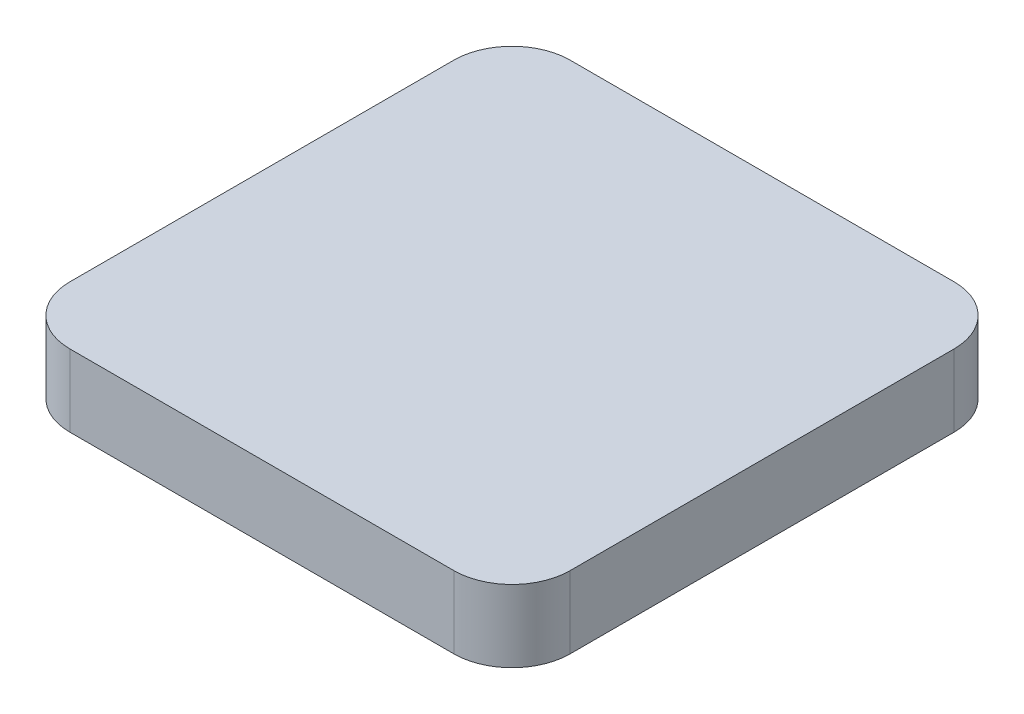
ISO-10303-21;
HEADER;
FILE_DESCRIPTION(('STEP AP214'),'2;1');
FILE_NAME('part.step','',(''),(''),'','','');
FILE_SCHEMA(('AUTOMOTIVE_DESIGN { 1 0 10303 214 1 1 1 1 }'));
ENDSEC;
DATA;
#1=APPLICATION_CONTEXT('core data for automotive mechanical design processes');
#2=APPLICATION_PROTOCOL_DEFINITION('international standard','automotive_design',2000,#1);
#3=PRODUCT_CONTEXT('',#1,'mechanical');
#4=PRODUCT('Part','Part','',(#3));
#5=PRODUCT_RELATED_PRODUCT_CATEGORY('part','',(#4));
#6=PRODUCT_DEFINITION_FORMATION('','',#4);
#7=PRODUCT_DEFINITION_CONTEXT('part definition',#1,'design');
#8=PRODUCT_DEFINITION('design','',#6,#7);
#9=PRODUCT_DEFINITION_SHAPE('','',#8);
#10=(LENGTH_UNIT() NAMED_UNIT(*) SI_UNIT(.MILLI.,.METRE.));
#11=(NAMED_UNIT(*) PLANE_ANGLE_UNIT() SI_UNIT($,.RADIAN.));
#12=(NAMED_UNIT(*) SI_UNIT($,.STERADIAN.) SOLID_ANGLE_UNIT());
#13=UNCERTAINTY_MEASURE_WITH_UNIT(LENGTH_MEASURE(1.E-05),#10,'distance_accuracy_value','');
#14=(GEOMETRIC_REPRESENTATION_CONTEXT(3) GLOBAL_UNCERTAINTY_ASSIGNED_CONTEXT((#13)) GLOBAL_UNIT_ASSIGNED_CONTEXT((#10,
#11,#12)) REPRESENTATION_CONTEXT('',''));
#15=CARTESIAN_POINT('',(0.,0.,0.));
#16=DIRECTION('',(0.,0.,1.));
#17=DIRECTION('',(1.,0.,0.));
#18=AXIS2_PLACEMENT_3D('',#15,#16,#17);
#19=CARTESIAN_POINT('',(-4.191,1.5748,-4.191));
#20=DIRECTION('',(0.,-1.,0.));
#21=DIRECTION('',(0.,0.,-1.));
#22=AXIS2_PLACEMENT_3D('',#19,#20,#21);
#23=CYLINDRICAL_SURFACE('',#22,1.27);
#24=CARTESIAN_POINT('',(-4.191,0.,-4.191));
#25=DIRECTION('',(0.,1.,0.));
#26=DIRECTION('',(0.,0.,1.));
#27=AXIS2_PLACEMENT_3D('',#24,#25,#26);
#28=CIRCLE('',#27,1.27);
#29=CARTESIAN_POINT('',(-4.19099999999999,0.,-5.461));
#30=VERTEX_POINT('',#29);
#31=CARTESIAN_POINT('',(-5.461,0.,-4.19099999999999));
#32=VERTEX_POINT('',#31);
#33=EDGE_CURVE('E129',#30,#32,#28,.T.);
#34=ORIENTED_EDGE('',*,*,#33,.T.);
#35=DIRECTION('',(0.,-1.,0.));
#36=VECTOR('',#35,1.);
#37=CARTESIAN_POINT('',(-5.461,1.5748,-4.19099999999999));
#38=LINE('',#37,#36);
#39=CARTESIAN_POINT('',(-5.461,1.5748,-4.19099999999999));
#40=VERTEX_POINT('',#39);
#41=EDGE_CURVE('E11',#40,#32,#38,.T.);
#42=ORIENTED_EDGE('',*,*,#41,.F.);
#43=CARTESIAN_POINT('',(-4.191,1.5748,-4.191));
#44=DIRECTION('',(0.,1.,0.));
#45=DIRECTION('',(0.,0.,1.));
#46=AXIS2_PLACEMENT_3D('',#43,#44,#45);
#47=CIRCLE('',#46,1.27);
#48=CARTESIAN_POINT('',(-4.19099999999999,1.5748,-5.461));
#49=VERTEX_POINT('',#48);
#50=EDGE_CURVE('E143',#49,#40,#47,.T.);
#51=ORIENTED_EDGE('',*,*,#50,.F.);
#52=DIRECTION('',(0.,-1.,0.));
#53=VECTOR('',#52,1.);
#54=CARTESIAN_POINT('',(-4.19099999999999,1.5748,-5.461));
#55=LINE('',#54,#53);
#56=EDGE_CURVE('E125',#49,#30,#55,.T.);
#57=ORIENTED_EDGE('',*,*,#56,.T.);
#58=EDGE_LOOP('',(#34,#42,#51,#57));
#59=FACE_BOUND('',#58,.T.);
#60=ADVANCED_FACE('F33',(#59),#23,.T.);
#61=CARTESIAN_POINT('',(-5.461,1.5748,-4.19099999999999));
#62=DIRECTION('',(1.,0.,0.));
#63=DIRECTION('',(0.,0.,-1.));
#64=AXIS2_PLACEMENT_3D('',#61,#62,#63);
#65=PLANE('',#64);
#66=DIRECTION('',(0.,0.,1.));
#67=VECTOR('',#66,1.);
#68=CARTESIAN_POINT('',(-5.461,0.,-4.19099999999999));
#69=LINE('',#68,#67);
#70=CARTESIAN_POINT('',(-5.461,0.,4.19099999999999));
#71=VERTEX_POINT('',#70);
#72=EDGE_CURVE('E132',#32,#71,#69,.T.);
#73=ORIENTED_EDGE('',*,*,#72,.T.);
#74=DIRECTION('',(0.,-1.,0.));
#75=VECTOR('',#74,1.);
#76=CARTESIAN_POINT('',(-5.461,1.5748,4.19099999999999));
#77=LINE('',#76,#75);
#78=CARTESIAN_POINT('',(-5.461,1.5748,4.19099999999999));
#79=VERTEX_POINT('',#78);
#80=EDGE_CURVE('E41',#79,#71,#77,.T.);
#81=ORIENTED_EDGE('',*,*,#80,.F.);
#82=DIRECTION('',(0.,0.,1.));
#83=VECTOR('',#82,1.);
#84=CARTESIAN_POINT('',(-5.461,1.5748,-4.19099999999999));
#85=LINE('',#84,#83);
#86=EDGE_CURVE('E92',#40,#79,#85,.T.);
#87=ORIENTED_EDGE('',*,*,#86,.F.);
#88=ORIENTED_EDGE('',*,*,#41,.T.);
#89=EDGE_LOOP('',(#73,#81,#87,#88));
#90=FACE_BOUND('',#89,.T.);
#91=ADVANCED_FACE('F178',(#90),#65,.F.);
#92=CARTESIAN_POINT('',(-4.191,1.5748,4.191));
#93=DIRECTION('',(0.,-1.,0.));
#94=DIRECTION('',(0.,0.,-1.));
#95=AXIS2_PLACEMENT_3D('',#92,#93,#94);
#96=CYLINDRICAL_SURFACE('',#95,1.27);
#97=CARTESIAN_POINT('',(-4.191,0.,4.191));
#98=DIRECTION('',(0.,1.,0.));
#99=DIRECTION('',(0.,0.,-1.));
#100=AXIS2_PLACEMENT_3D('',#97,#98,#99);
#101=CIRCLE('',#100,1.27);
#102=CARTESIAN_POINT('',(-4.19099999999999,0.,5.461));
#103=VERTEX_POINT('',#102);
#104=EDGE_CURVE('E134',#71,#103,#101,.T.);
#105=ORIENTED_EDGE('',*,*,#104,.T.);
#106=DIRECTION('',(0.,-1.,0.));
#107=VECTOR('',#106,1.);
#108=CARTESIAN_POINT('',(-4.19099999999999,1.5748,5.461));
#109=LINE('',#108,#107);
#110=CARTESIAN_POINT('',(-4.19099999999999,1.5748,5.461));
#111=VERTEX_POINT('',#110);
#112=EDGE_CURVE('E150',#111,#103,#109,.T.);
#113=ORIENTED_EDGE('',*,*,#112,.F.);
#114=CARTESIAN_POINT('',(-4.191,1.5748,4.191));
#115=DIRECTION('',(0.,1.,0.));
#116=DIRECTION('',(0.,0.,-1.));
#117=AXIS2_PLACEMENT_3D('',#114,#115,#116);
#118=CIRCLE('',#117,1.27);
#119=EDGE_CURVE('E158',#79,#111,#118,.T.);
#120=ORIENTED_EDGE('',*,*,#119,.F.);
#121=ORIENTED_EDGE('',*,*,#80,.T.);
#122=EDGE_LOOP('',(#105,#113,#120,#121));
#123=FACE_BOUND('',#122,.T.);
#124=ADVANCED_FACE('F156',(#123),#96,.T.);
#125=CARTESIAN_POINT('',(-4.19099999999999,1.5748,5.461));
#126=DIRECTION('',(0.,0.,-1.));
#127=DIRECTION('',(-1.,0.,0.));
#128=AXIS2_PLACEMENT_3D('',#125,#126,#127);
#129=PLANE('',#128);
#130=DIRECTION('',(1.,0.,0.));
#131=VECTOR('',#130,1.);
#132=CARTESIAN_POINT('',(-4.19099999999999,0.,5.461));
#133=LINE('',#132,#131);
#134=CARTESIAN_POINT('',(4.19099999999999,0.,5.461));
#135=VERTEX_POINT('',#134);
#136=EDGE_CURVE('E136',#103,#135,#133,.T.);
#137=ORIENTED_EDGE('',*,*,#136,.T.);
#138=DIRECTION('',(0.,-1.,0.));
#139=VECTOR('',#138,1.);
#140=CARTESIAN_POINT('',(4.19099999999999,1.5748,5.461));
#141=LINE('',#140,#139);
#142=CARTESIAN_POINT('',(4.19099999999999,1.5748,5.461));
#143=VERTEX_POINT('',#142);
#144=EDGE_CURVE('E147',#143,#135,#141,.T.);
#145=ORIENTED_EDGE('',*,*,#144,.F.);
#146=DIRECTION('',(1.,0.,0.));
#147=VECTOR('',#146,1.);
#148=CARTESIAN_POINT('',(-4.19099999999999,1.5748,5.461));
#149=LINE('',#148,#147);
#150=EDGE_CURVE('E170',#111,#143,#149,.T.);
#151=ORIENTED_EDGE('',*,*,#150,.F.);
#152=ORIENTED_EDGE('',*,*,#112,.T.);
#153=EDGE_LOOP('',(#137,#145,#151,#152));
#154=FACE_BOUND('',#153,.T.);
#155=ADVANCED_FACE('F166',(#154),#129,.F.);
#156=CARTESIAN_POINT('',(4.191,1.5748,4.191));
#157=DIRECTION('',(0.,-1.,0.));
#158=DIRECTION('',(0.,0.,-1.));
#159=AXIS2_PLACEMENT_3D('',#156,#157,#158);
#160=CYLINDRICAL_SURFACE('',#159,1.27);
#161=CARTESIAN_POINT('',(4.191,0.,4.191));
#162=DIRECTION('',(0.,1.,0.));
#163=DIRECTION('',(0.,0.,1.));
#164=AXIS2_PLACEMENT_3D('',#161,#162,#163);
#165=CIRCLE('',#164,1.27);
#166=CARTESIAN_POINT('',(5.461,0.,4.19099999999999));
#167=VERTEX_POINT('',#166);
#168=EDGE_CURVE('E138',#135,#167,#165,.T.);
#169=ORIENTED_EDGE('',*,*,#168,.T.);
#170=DIRECTION('',(0.,-1.,0.));
#171=VECTOR('',#170,1.);
#172=CARTESIAN_POINT('',(5.461,1.5748,4.19099999999999));
#173=LINE('',#172,#171);
#174=CARTESIAN_POINT('',(5.461,1.5748,4.19099999999999));
#175=VERTEX_POINT('',#174);
#176=EDGE_CURVE('E120',#175,#167,#173,.T.);
#177=ORIENTED_EDGE('',*,*,#176,.F.);
#178=CARTESIAN_POINT('',(4.191,1.5748,4.191));
#179=DIRECTION('',(0.,1.,0.));
#180=DIRECTION('',(0.,0.,1.));
#181=AXIS2_PLACEMENT_3D('',#178,#179,#180);
#182=CIRCLE('',#181,1.27);
#183=EDGE_CURVE('E111',#143,#175,#182,.T.);
#184=ORIENTED_EDGE('',*,*,#183,.F.);
#185=ORIENTED_EDGE('',*,*,#144,.T.);
#186=EDGE_LOOP('',(#169,#177,#184,#185));
#187=FACE_BOUND('',#186,.T.);
#188=ADVANCED_FACE('F169',(#187),#160,.T.);
#189=CARTESIAN_POINT('',(5.461,1.5748,-4.19099999999999));
#190=DIRECTION('',(-1.,0.,0.));
#191=DIRECTION('',(0.,0.,1.));
#192=AXIS2_PLACEMENT_3D('',#189,#190,#191);
#193=PLANE('',#192);
#194=DIRECTION('',(0.,0.,-1.));
#195=VECTOR('',#194,1.);
#196=CARTESIAN_POINT('',(5.461,0.,-4.19099999999999));
#197=LINE('',#196,#195);
#198=CARTESIAN_POINT('',(5.461,0.,-4.19099999999999));
#199=VERTEX_POINT('',#198);
#200=EDGE_CURVE('E119',#167,#199,#197,.T.);
#201=ORIENTED_EDGE('',*,*,#200,.T.);
#202=DIRECTION('',(0.,-1.,0.));
#203=VECTOR('',#202,1.);
#204=CARTESIAN_POINT('',(5.461,1.5748,-4.19099999999999));
#205=LINE('',#204,#203);
#206=CARTESIAN_POINT('',(5.461,1.5748,-4.19099999999999));
#207=VERTEX_POINT('',#206);
#208=EDGE_CURVE('E116',#207,#199,#205,.T.);
#209=ORIENTED_EDGE('',*,*,#208,.F.);
#210=DIRECTION('',(0.,0.,-1.));
#211=VECTOR('',#210,1.);
#212=CARTESIAN_POINT('',(5.461,1.5748,-4.19099999999999));
#213=LINE('',#212,#211);
#214=EDGE_CURVE('E105',#175,#207,#213,.T.);
#215=ORIENTED_EDGE('',*,*,#214,.F.);
#216=ORIENTED_EDGE('',*,*,#176,.T.);
#217=EDGE_LOOP('',(#201,#209,#215,#216));
#218=FACE_BOUND('',#217,.T.);
#219=ADVANCED_FACE('F117',(#218),#193,.F.);
#220=CARTESIAN_POINT('',(4.191,1.5748,-4.191));
#221=DIRECTION('',(0.,-1.,0.));
#222=DIRECTION('',(0.,0.,-1.));
#223=AXIS2_PLACEMENT_3D('',#220,#221,#222);
#224=CYLINDRICAL_SURFACE('',#223,1.27);
#225=CARTESIAN_POINT('',(4.191,0.,-4.191));
#226=DIRECTION('',(0.,1.,0.));
#227=DIRECTION('',(0.,0.,1.));
#228=AXIS2_PLACEMENT_3D('',#225,#226,#227);
#229=CIRCLE('',#228,1.27);
#230=CARTESIAN_POINT('',(4.19099999999999,0.,-5.461));
#231=VERTEX_POINT('',#230);
#232=EDGE_CURVE('E78',#199,#231,#229,.T.);
#233=ORIENTED_EDGE('',*,*,#232,.T.);
#234=DIRECTION('',(0.,-1.,0.));
#235=VECTOR('',#234,1.);
#236=CARTESIAN_POINT('',(4.19099999999999,1.5748,-5.461));
#237=LINE('',#236,#235);
#238=CARTESIAN_POINT('',(4.19099999999999,1.5748,-5.461));
#239=VERTEX_POINT('',#238);
#240=EDGE_CURVE('E121',#239,#231,#237,.T.);
#241=ORIENTED_EDGE('',*,*,#240,.F.);
#242=CARTESIAN_POINT('',(4.191,1.5748,-4.191));
#243=DIRECTION('',(0.,1.,0.));
#244=DIRECTION('',(0.,0.,1.));
#245=AXIS2_PLACEMENT_3D('',#242,#243,#244);
#246=CIRCLE('',#245,1.27);
#247=EDGE_CURVE('E109',#207,#239,#246,.T.);
#248=ORIENTED_EDGE('',*,*,#247,.F.);
#249=ORIENTED_EDGE('',*,*,#208,.T.);
#250=EDGE_LOOP('',(#233,#241,#248,#249));
#251=FACE_BOUND('',#250,.T.);
#252=ADVANCED_FACE('F123',(#251),#224,.T.);
#253=CARTESIAN_POINT('',(-4.19099999999999,1.5748,-5.461));
#254=DIRECTION('',(0.,0.,1.));
#255=DIRECTION('',(1.,0.,0.));
#256=AXIS2_PLACEMENT_3D('',#253,#254,#255);
#257=PLANE('',#256);
#258=DIRECTION('',(-1.,0.,0.));
#259=VECTOR('',#258,1.);
#260=CARTESIAN_POINT('',(-4.19099999999999,0.,-5.461));
#261=LINE('',#260,#259);
#262=EDGE_CURVE('E84',#231,#30,#261,.T.);
#263=ORIENTED_EDGE('',*,*,#262,.T.);
#264=ORIENTED_EDGE('',*,*,#56,.F.);
#265=DIRECTION('',(-1.,0.,0.));
#266=VECTOR('',#265,1.);
#267=CARTESIAN_POINT('',(-4.19099999999999,1.5748,-5.461));
#268=LINE('',#267,#266);
#269=EDGE_CURVE('E49',#239,#49,#268,.T.);
#270=ORIENTED_EDGE('',*,*,#269,.F.);
#271=ORIENTED_EDGE('',*,*,#240,.T.);
#272=EDGE_LOOP('',(#263,#264,#270,#271));
#273=FACE_BOUND('',#272,.T.);
#274=ADVANCED_FACE('F194',(#273),#257,.F.);
#275=CARTESIAN_POINT('',(-4.191,1.5748,-4.191));
#276=DIRECTION('',(0.,1.,0.));
#277=DIRECTION('',(0.,0.,1.));
#278=AXIS2_PLACEMENT_3D('',#275,#276,#277);
#279=PLANE('',#278);
#280=ORIENTED_EDGE('',*,*,#50,.T.);
#281=ORIENTED_EDGE('',*,*,#86,.T.);
#282=ORIENTED_EDGE('',*,*,#119,.T.);
#283=ORIENTED_EDGE('',*,*,#150,.T.);
#284=ORIENTED_EDGE('',*,*,#183,.T.);
#285=ORIENTED_EDGE('',*,*,#214,.T.);
#286=ORIENTED_EDGE('',*,*,#247,.T.);
#287=ORIENTED_EDGE('',*,*,#269,.T.);
#288=EDGE_LOOP('',(#280,#281,#282,#283,#284,#285,#286,#287));
#289=FACE_BOUND('',#288,.T.);
#290=ADVANCED_FACE('F107',(#289),#279,.T.);
#291=CARTESIAN_POINT('',(-4.191,0.,-4.191));
#292=DIRECTION('',(0.,1.,0.));
#293=DIRECTION('',(0.,0.,1.));
#294=AXIS2_PLACEMENT_3D('',#291,#292,#293);
#295=PLANE('',#294);
#296=ORIENTED_EDGE('',*,*,#33,.F.);
#297=ORIENTED_EDGE('',*,*,#262,.F.);
#298=ORIENTED_EDGE('',*,*,#232,.F.);
#299=ORIENTED_EDGE('',*,*,#200,.F.);
#300=ORIENTED_EDGE('',*,*,#168,.F.);
#301=ORIENTED_EDGE('',*,*,#136,.F.);
#302=ORIENTED_EDGE('',*,*,#104,.F.);
#303=ORIENTED_EDGE('',*,*,#72,.F.);
#304=EDGE_LOOP('',(#296,#297,#298,#299,#300,#301,#302,#303));
#305=FACE_BOUND('',#304,.T.);
#306=ADVANCED_FACE('F162',(#305),#295,.F.);
#307=CLOSED_SHELL('',(#60,#91,#124,#155,#188,#219,#252,#274,#290,#306));
#308=MANIFOLD_SOLID_BREP('B2',#307);
#309=ADVANCED_BREP_SHAPE_REPRESENTATION('',(#18,#308),#14);
#310=SHAPE_DEFINITION_REPRESENTATION(#9,#309);
ENDSEC;
END-ISO-10303-21;
